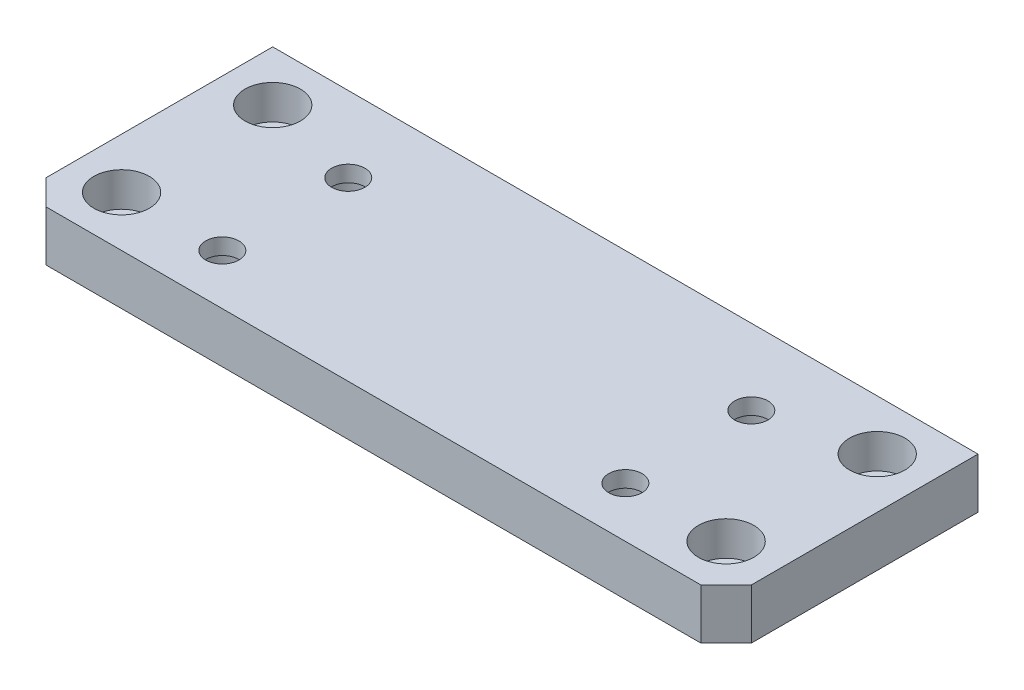
ISO-10303-21;
HEADER;
FILE_DESCRIPTION(('STEP AP214'),'2;1');
FILE_NAME('part.step','',(''),(''),'','','');
FILE_SCHEMA(('AUTOMOTIVE_DESIGN { 1 0 10303 214 1 1 1 1 }'));
ENDSEC;
DATA;
#1=APPLICATION_CONTEXT('core data for automotive mechanical design processes');
#2=APPLICATION_PROTOCOL_DEFINITION('international standard','automotive_design',2000,#1);
#3=PRODUCT_CONTEXT('',#1,'mechanical');
#4=PRODUCT('Part','Part','',(#3));
#5=PRODUCT_RELATED_PRODUCT_CATEGORY('part','',(#4));
#6=PRODUCT_DEFINITION_FORMATION('','',#4);
#7=PRODUCT_DEFINITION_CONTEXT('part definition',#1,'design');
#8=PRODUCT_DEFINITION('design','',#6,#7);
#9=PRODUCT_DEFINITION_SHAPE('','',#8);
#10=(LENGTH_UNIT() NAMED_UNIT(*) SI_UNIT(.MILLI.,.METRE.));
#11=(NAMED_UNIT(*) PLANE_ANGLE_UNIT() SI_UNIT($,.RADIAN.));
#12=(NAMED_UNIT(*) SI_UNIT($,.STERADIAN.) SOLID_ANGLE_UNIT());
#13=UNCERTAINTY_MEASURE_WITH_UNIT(LENGTH_MEASURE(1.E-05),#10,'distance_accuracy_value','');
#14=(GEOMETRIC_REPRESENTATION_CONTEXT(3) GLOBAL_UNCERTAINTY_ASSIGNED_CONTEXT((#13)) GLOBAL_UNIT_ASSIGNED_CONTEXT((#10,
#11,#12)) REPRESENTATION_CONTEXT('',''));
#15=CARTESIAN_POINT('',(0.,0.,0.));
#16=DIRECTION('',(0.,0.,1.));
#17=DIRECTION('',(1.,0.,0.));
#18=AXIS2_PLACEMENT_3D('',#15,#16,#17);
#19=CARTESIAN_POINT('',(-70.,10.,25.));
#20=DIRECTION('',(1.,0.,0.));
#21=DIRECTION('',(0.,0.,-1.));
#22=AXIS2_PLACEMENT_3D('',#19,#20,#21);
#23=PLANE('',#22);
#24=DIRECTION('',(0.,0.,1.));
#25=VECTOR('',#24,1.);
#26=CARTESIAN_POINT('',(-70.,0.,25.));
#27=LINE('',#26,#25);
#28=CARTESIAN_POINT('',(-70.,0.,-25.));
#29=VERTEX_POINT('',#28);
#30=CARTESIAN_POINT('',(-70.,0.,20.));
#31=VERTEX_POINT('',#30);
#32=EDGE_CURVE('E129',#29,#31,#27,.T.);
#33=ORIENTED_EDGE('',*,*,#32,.T.);
#34=DIRECTION('',(0.,1.,0.));
#35=VECTOR('',#34,1.);
#36=CARTESIAN_POINT('',(-70.,10.,20.));
#37=LINE('',#36,#35);
#38=CARTESIAN_POINT('',(-70.,10.,20.));
#39=VERTEX_POINT('',#38);
#40=EDGE_CURVE('E69',#31,#39,#37,.T.);
#41=ORIENTED_EDGE('',*,*,#40,.T.);
#42=DIRECTION('',(0.,0.,1.));
#43=VECTOR('',#42,1.);
#44=CARTESIAN_POINT('',(-70.,10.,25.));
#45=LINE('',#44,#43);
#46=CARTESIAN_POINT('',(-70.,10.,-25.));
#47=VERTEX_POINT('',#46);
#48=EDGE_CURVE('E141',#47,#39,#45,.T.);
#49=ORIENTED_EDGE('',*,*,#48,.F.);
#50=DIRECTION('',(0.,-1.,0.));
#51=VECTOR('',#50,1.);
#52=CARTESIAN_POINT('',(-70.,10.,-25.));
#53=LINE('',#52,#51);
#54=EDGE_CURVE('E119',#47,#29,#53,.T.);
#55=ORIENTED_EDGE('',*,*,#54,.T.);
#56=EDGE_LOOP('',(#33,#41,#49,#55));
#57=FACE_BOUND('',#56,.T.);
#58=ADVANCED_FACE('F44',(#57),#23,.F.);
#59=CARTESIAN_POINT('',(70.,10.,25.));
#60=DIRECTION('',(0.,0.,-1.));
#61=DIRECTION('',(-1.,0.,0.));
#62=AXIS2_PLACEMENT_3D('',#59,#60,#61);
#63=PLANE('',#62);
#64=DIRECTION('',(1.,0.,0.));
#65=VECTOR('',#64,1.);
#66=CARTESIAN_POINT('',(70.,10.,25.));
#67=LINE('',#66,#65);
#68=CARTESIAN_POINT('',(-65.,10.,25.));
#69=VERTEX_POINT('',#68);
#70=CARTESIAN_POINT('',(65.,10.,25.));
#71=VERTEX_POINT('',#70);
#72=EDGE_CURVE('E108',#69,#71,#67,.T.);
#73=ORIENTED_EDGE('',*,*,#72,.F.);
#74=DIRECTION('',(0.,-1.,0.));
#75=VECTOR('',#74,1.);
#76=CARTESIAN_POINT('',(-65.,10.,25.));
#77=LINE('',#76,#75);
#78=CARTESIAN_POINT('',(-65.,0.,25.));
#79=VERTEX_POINT('',#78);
#80=EDGE_CURVE('E145',#69,#79,#77,.T.);
#81=ORIENTED_EDGE('',*,*,#80,.T.);
#82=DIRECTION('',(1.,0.,0.));
#83=VECTOR('',#82,1.);
#84=CARTESIAN_POINT('',(70.,0.,25.));
#85=LINE('',#84,#83);
#86=CARTESIAN_POINT('',(65.,0.,25.));
#87=VERTEX_POINT('',#86);
#88=EDGE_CURVE('E132',#79,#87,#85,.T.);
#89=ORIENTED_EDGE('',*,*,#88,.T.);
#90=DIRECTION('',(0.,1.,0.));
#91=VECTOR('',#90,1.);
#92=CARTESIAN_POINT('',(65.,10.,25.));
#93=LINE('',#92,#91);
#94=EDGE_CURVE('E118',#87,#71,#93,.T.);
#95=ORIENTED_EDGE('',*,*,#94,.T.);
#96=EDGE_LOOP('',(#73,#81,#89,#95));
#97=FACE_BOUND('',#96,.T.);
#98=ADVANCED_FACE('F164',(#97),#63,.F.);
#99=CARTESIAN_POINT('',(70.,10.,25.));
#100=DIRECTION('',(-1.,0.,0.));
#101=DIRECTION('',(0.,0.,1.));
#102=AXIS2_PLACEMENT_3D('',#99,#100,#101);
#103=PLANE('',#102);
#104=DIRECTION('',(0.,0.,-1.));
#105=VECTOR('',#104,1.);
#106=CARTESIAN_POINT('',(70.,10.,25.));
#107=LINE('',#106,#105);
#108=CARTESIAN_POINT('',(70.,10.,20.));
#109=VERTEX_POINT('',#108);
#110=CARTESIAN_POINT('',(70.,10.,-25.));
#111=VERTEX_POINT('',#110);
#112=EDGE_CURVE('E99',#109,#111,#107,.T.);
#113=ORIENTED_EDGE('',*,*,#112,.F.);
#114=DIRECTION('',(0.,-1.,0.));
#115=VECTOR('',#114,1.);
#116=CARTESIAN_POINT('',(70.,10.,20.));
#117=LINE('',#116,#115);
#118=CARTESIAN_POINT('',(70.,0.,20.));
#119=VERTEX_POINT('',#118);
#120=EDGE_CURVE('E11',#109,#119,#117,.T.);
#121=ORIENTED_EDGE('',*,*,#120,.T.);
#122=DIRECTION('',(0.,0.,-1.));
#123=VECTOR('',#122,1.);
#124=CARTESIAN_POINT('',(70.,0.,25.));
#125=LINE('',#124,#123);
#126=CARTESIAN_POINT('',(70.,0.,-25.));
#127=VERTEX_POINT('',#126);
#128=EDGE_CURVE('E114',#119,#127,#125,.T.);
#129=ORIENTED_EDGE('',*,*,#128,.T.);
#130=DIRECTION('',(0.,-1.,0.));
#131=VECTOR('',#130,1.);
#132=CARTESIAN_POINT('',(70.,10.,-25.));
#133=LINE('',#132,#131);
#134=EDGE_CURVE('E111',#111,#127,#133,.T.);
#135=ORIENTED_EDGE('',*,*,#134,.F.);
#136=EDGE_LOOP('',(#113,#121,#129,#135));
#137=FACE_BOUND('',#136,.T.);
#138=ADVANCED_FACE('F112',(#137),#103,.F.);
#139=CARTESIAN_POINT('',(70.,10.,-25.));
#140=DIRECTION('',(0.,0.,1.));
#141=DIRECTION('',(1.,0.,0.));
#142=AXIS2_PLACEMENT_3D('',#139,#140,#141);
#143=PLANE('',#142);
#144=DIRECTION('',(-1.,0.,0.));
#145=VECTOR('',#144,1.);
#146=CARTESIAN_POINT('',(70.,0.,-25.));
#147=LINE('',#146,#145);
#148=EDGE_CURVE('E139',#127,#29,#147,.T.);
#149=ORIENTED_EDGE('',*,*,#148,.T.);
#150=ORIENTED_EDGE('',*,*,#54,.F.);
#151=DIRECTION('',(-1.,0.,0.));
#152=VECTOR('',#151,1.);
#153=CARTESIAN_POINT('',(70.,10.,-25.));
#154=LINE('',#153,#152);
#155=EDGE_CURVE('E103',#111,#47,#154,.T.);
#156=ORIENTED_EDGE('',*,*,#155,.F.);
#157=ORIENTED_EDGE('',*,*,#134,.T.);
#158=EDGE_LOOP('',(#149,#150,#156,#157));
#159=FACE_BOUND('',#158,.T.);
#160=ADVANCED_FACE('F121',(#159),#143,.F.);
#161=CARTESIAN_POINT('',(0.,10.,0.));
#162=DIRECTION('',(0.,1.,0.));
#163=DIRECTION('',(0.,0.,1.));
#164=AXIS2_PLACEMENT_3D('',#161,#162,#163);
#165=PLANE('',#164);
#166=CARTESIAN_POINT('',(40.,10.,-10.));
#167=DIRECTION('',(0.,-1.,0.));
#168=DIRECTION('',(0.,0.,-1.));
#169=AXIS2_PLACEMENT_3D('',#166,#167,#168);
#170=CIRCLE('',#169,3.3);
#171=CARTESIAN_POINT('',(40.,10.,-13.3));
#172=VERTEX_POINT('',#171);
#173=EDGE_CURVE('E286',#172,#172,#170,.T.);
#174=ORIENTED_EDGE('',*,*,#173,.T.);
#175=EDGE_LOOP('',(#174));
#176=FACE_BOUND('',#175,.T.);
#177=CARTESIAN_POINT('',(40.,10.,15.));
#178=DIRECTION('',(0.,-1.,0.));
#179=DIRECTION('',(0.,0.,-1.));
#180=AXIS2_PLACEMENT_3D('',#177,#178,#179);
#181=CIRCLE('',#180,3.3);
#182=CARTESIAN_POINT('',(40.,10.,11.7));
#183=VERTEX_POINT('',#182);
#184=EDGE_CURVE('E270',#183,#183,#181,.T.);
#185=ORIENTED_EDGE('',*,*,#184,.T.);
#186=EDGE_LOOP('',(#185));
#187=FACE_BOUND('',#186,.T.);
#188=CARTESIAN_POINT('',(-40.,10.,15.));
#189=DIRECTION('',(0.,-1.,0.));
#190=DIRECTION('',(0.,0.,-1.));
#191=AXIS2_PLACEMENT_3D('',#188,#189,#190);
#192=CIRCLE('',#191,3.3);
#193=CARTESIAN_POINT('',(-40.,10.,11.7));
#194=VERTEX_POINT('',#193);
#195=EDGE_CURVE('E254',#194,#194,#192,.T.);
#196=ORIENTED_EDGE('',*,*,#195,.T.);
#197=EDGE_LOOP('',(#196));
#198=FACE_BOUND('',#197,.T.);
#199=CARTESIAN_POINT('',(-40.,10.,-10.));
#200=DIRECTION('',(0.,-1.,0.));
#201=DIRECTION('',(0.,0.,-1.));
#202=AXIS2_PLACEMENT_3D('',#199,#200,#201);
#203=CIRCLE('',#202,3.3);
#204=CARTESIAN_POINT('',(-40.,10.,-13.3));
#205=VERTEX_POINT('',#204);
#206=EDGE_CURVE('E238',#205,#205,#203,.T.);
#207=ORIENTED_EDGE('',*,*,#206,.T.);
#208=EDGE_LOOP('',(#207));
#209=FACE_BOUND('',#208,.T.);
#210=CARTESIAN_POINT('',(-60.,10.,-15.));
#211=DIRECTION('',(0.,1.,0.));
#212=DIRECTION('',(0.,0.,1.));
#213=AXIS2_PLACEMENT_3D('',#210,#211,#212);
#214=CIRCLE('',#213,5.49999999999999);
#215=CARTESIAN_POINT('',(-60.,10.,-9.50000000000001));
#216=VERTEX_POINT('',#215);
#217=EDGE_CURVE('E234',#216,#216,#214,.T.);
#218=ORIENTED_EDGE('',*,*,#217,.F.);
#219=EDGE_LOOP('',(#218));
#220=FACE_BOUND('',#219,.T.);
#221=CARTESIAN_POINT('',(60.,10.,-15.));
#222=DIRECTION('',(0.,1.,0.));
#223=DIRECTION('',(0.,0.,1.));
#224=AXIS2_PLACEMENT_3D('',#221,#222,#223);
#225=CIRCLE('',#224,5.49999999999999);
#226=CARTESIAN_POINT('',(60.,10.,-9.50000000000003));
#227=VERTEX_POINT('',#226);
#228=EDGE_CURVE('E218',#227,#227,#225,.T.);
#229=ORIENTED_EDGE('',*,*,#228,.F.);
#230=EDGE_LOOP('',(#229));
#231=FACE_BOUND('',#230,.T.);
#232=CARTESIAN_POINT('',(60.,10.,15.));
#233=DIRECTION('',(0.,1.,0.));
#234=DIRECTION('',(0.,0.,1.));
#235=AXIS2_PLACEMENT_3D('',#232,#233,#234);
#236=CIRCLE('',#235,5.49999999999999);
#237=CARTESIAN_POINT('',(60.,10.,20.5));
#238=VERTEX_POINT('',#237);
#239=EDGE_CURVE('E202',#238,#238,#236,.T.);
#240=ORIENTED_EDGE('',*,*,#239,.F.);
#241=EDGE_LOOP('',(#240));
#242=FACE_BOUND('',#241,.T.);
#243=CARTESIAN_POINT('',(-60.,10.,15.));
#244=DIRECTION('',(0.,1.,0.));
#245=DIRECTION('',(0.,0.,1.));
#246=AXIS2_PLACEMENT_3D('',#243,#244,#245);
#247=CIRCLE('',#246,5.49999999999999);
#248=CARTESIAN_POINT('',(-60.,10.,20.5));
#249=VERTEX_POINT('',#248);
#250=EDGE_CURVE('E186',#249,#249,#247,.T.);
#251=ORIENTED_EDGE('',*,*,#250,.F.);
#252=EDGE_LOOP('',(#251));
#253=FACE_BOUND('',#252,.T.);
#254=ORIENTED_EDGE('',*,*,#48,.T.);
#255=DIRECTION('',(-0.707106781186548,0.,-0.707106781186548));
#256=VECTOR('',#255,1.);
#257=CARTESIAN_POINT('',(-45.,10.,45.));
#258=LINE('',#257,#256);
#259=EDGE_CURVE('E54',#39,#69,#258,.F.);
#260=ORIENTED_EDGE('',*,*,#259,.T.);
#261=ORIENTED_EDGE('',*,*,#72,.T.);
#262=DIRECTION('',(-0.707106781186549,0.,0.707106781186547));
#263=VECTOR('',#262,1.);
#264=CARTESIAN_POINT('',(44.9999999999999,10.,45.));
#265=LINE('',#264,#263);
#266=EDGE_CURVE('E61',#71,#109,#265,.F.);
#267=ORIENTED_EDGE('',*,*,#266,.T.);
#268=ORIENTED_EDGE('',*,*,#112,.T.);
#269=ORIENTED_EDGE('',*,*,#155,.T.);
#270=EDGE_LOOP('',(#254,#260,#261,#267,#268,#269));
#271=FACE_BOUND('',#270,.T.);
#272=ADVANCED_FACE('F101',(#176,#187,#198,#209,#220,#231,#242,#253,#271),#165,.T.);
#273=CARTESIAN_POINT('',(0.,0.,0.));
#274=DIRECTION('',(0.,1.,0.));
#275=DIRECTION('',(0.,0.,1.));
#276=AXIS2_PLACEMENT_3D('',#273,#274,#275);
#277=PLANE('',#276);
#278=CARTESIAN_POINT('',(40.,0.,-10.));
#279=DIRECTION('',(0.,-1.,0.));
#280=DIRECTION('',(0.,0.,-1.));
#281=AXIS2_PLACEMENT_3D('',#278,#279,#280);
#282=CIRCLE('',#281,5.5);
#283=CARTESIAN_POINT('',(40.,0.,-15.5));
#284=VERTEX_POINT('',#283);
#285=EDGE_CURVE('E298',#284,#284,#282,.T.);
#286=ORIENTED_EDGE('',*,*,#285,.F.);
#287=EDGE_LOOP('',(#286));
#288=FACE_BOUND('',#287,.T.);
#289=CARTESIAN_POINT('',(40.,0.,15.));
#290=DIRECTION('',(0.,-1.,0.));
#291=DIRECTION('',(0.,0.,-1.));
#292=AXIS2_PLACEMENT_3D('',#289,#290,#291);
#293=CIRCLE('',#292,5.49999999999999);
#294=CARTESIAN_POINT('',(40.,0.,9.50000000000002));
#295=VERTEX_POINT('',#294);
#296=EDGE_CURVE('E282',#295,#295,#293,.T.);
#297=ORIENTED_EDGE('',*,*,#296,.F.);
#298=EDGE_LOOP('',(#297));
#299=FACE_BOUND('',#298,.T.);
#300=CARTESIAN_POINT('',(-40.,0.,15.));
#301=DIRECTION('',(0.,-1.,0.));
#302=DIRECTION('',(0.,0.,-1.));
#303=AXIS2_PLACEMENT_3D('',#300,#301,#302);
#304=CIRCLE('',#303,5.49999999999999);
#305=CARTESIAN_POINT('',(-40.,0.,9.50000000000002));
#306=VERTEX_POINT('',#305);
#307=EDGE_CURVE('E266',#306,#306,#304,.T.);
#308=ORIENTED_EDGE('',*,*,#307,.F.);
#309=EDGE_LOOP('',(#308));
#310=FACE_BOUND('',#309,.T.);
#311=CARTESIAN_POINT('',(-40.,0.,-10.));
#312=DIRECTION('',(0.,-1.,0.));
#313=DIRECTION('',(0.,0.,-1.));
#314=AXIS2_PLACEMENT_3D('',#311,#312,#313);
#315=CIRCLE('',#314,5.5);
#316=CARTESIAN_POINT('',(-40.,0.,-15.5));
#317=VERTEX_POINT('',#316);
#318=EDGE_CURVE('E250',#317,#317,#315,.T.);
#319=ORIENTED_EDGE('',*,*,#318,.F.);
#320=EDGE_LOOP('',(#319));
#321=FACE_BOUND('',#320,.T.);
#322=CARTESIAN_POINT('',(-60.,0.,-15.));
#323=DIRECTION('',(0.,1.,0.));
#324=DIRECTION('',(0.,0.,1.));
#325=AXIS2_PLACEMENT_3D('',#322,#323,#324);
#326=CIRCLE('',#325,3.3);
#327=CARTESIAN_POINT('',(-60.,0.,-11.7));
#328=VERTEX_POINT('',#327);
#329=EDGE_CURVE('E222',#328,#328,#326,.T.);
#330=ORIENTED_EDGE('',*,*,#329,.T.);
#331=EDGE_LOOP('',(#330));
#332=FACE_BOUND('',#331,.T.);
#333=CARTESIAN_POINT('',(60.,0.,-15.));
#334=DIRECTION('',(0.,1.,0.));
#335=DIRECTION('',(0.,0.,1.));
#336=AXIS2_PLACEMENT_3D('',#333,#334,#335);
#337=CIRCLE('',#336,3.3);
#338=CARTESIAN_POINT('',(60.,0.,-11.7));
#339=VERTEX_POINT('',#338);
#340=EDGE_CURVE('E206',#339,#339,#337,.T.);
#341=ORIENTED_EDGE('',*,*,#340,.T.);
#342=EDGE_LOOP('',(#341));
#343=FACE_BOUND('',#342,.T.);
#344=CARTESIAN_POINT('',(60.,0.,15.));
#345=DIRECTION('',(0.,1.,0.));
#346=DIRECTION('',(0.,0.,1.));
#347=AXIS2_PLACEMENT_3D('',#344,#345,#346);
#348=CIRCLE('',#347,3.3);
#349=CARTESIAN_POINT('',(60.,0.,18.3));
#350=VERTEX_POINT('',#349);
#351=EDGE_CURVE('E190',#350,#350,#348,.T.);
#352=ORIENTED_EDGE('',*,*,#351,.T.);
#353=EDGE_LOOP('',(#352));
#354=FACE_BOUND('',#353,.T.);
#355=CARTESIAN_POINT('',(-60.,0.,15.));
#356=DIRECTION('',(0.,1.,0.));
#357=DIRECTION('',(0.,0.,1.));
#358=AXIS2_PLACEMENT_3D('',#355,#356,#357);
#359=CIRCLE('',#358,3.3);
#360=CARTESIAN_POINT('',(-60.,0.,18.3));
#361=VERTEX_POINT('',#360);
#362=EDGE_CURVE('E133',#361,#361,#359,.T.);
#363=ORIENTED_EDGE('',*,*,#362,.T.);
#364=EDGE_LOOP('',(#363));
#365=FACE_BOUND('',#364,.T.);
#366=ORIENTED_EDGE('',*,*,#88,.F.);
#367=DIRECTION('',(0.707106781186548,0.,0.707106781186548));
#368=VECTOR('',#367,1.);
#369=CARTESIAN_POINT('',(-65.,0.,25.));
#370=LINE('',#369,#368);
#371=EDGE_CURVE('E152',#79,#31,#370,.F.);
#372=ORIENTED_EDGE('',*,*,#371,.T.);
#373=ORIENTED_EDGE('',*,*,#32,.F.);
#374=ORIENTED_EDGE('',*,*,#148,.F.);
#375=ORIENTED_EDGE('',*,*,#128,.F.);
#376=DIRECTION('',(0.707106781186549,0.,-0.707106781186547));
#377=VECTOR('',#376,1.);
#378=CARTESIAN_POINT('',(70.,0.,20.));
#379=LINE('',#378,#377);
#380=EDGE_CURVE('E149',#119,#87,#379,.F.);
#381=ORIENTED_EDGE('',*,*,#380,.T.);
#382=EDGE_LOOP('',(#366,#372,#373,#374,#375,#381));
#383=FACE_BOUND('',#382,.T.);
#384=ADVANCED_FACE('F171',(#288,#299,#310,#321,#332,#343,#354,#365,#383),#277,.F.);
#385=CARTESIAN_POINT('',(-60.,10.,15.));
#386=DIRECTION('',(0.,1.,0.));
#387=DIRECTION('',(0.,0.,1.));
#388=AXIS2_PLACEMENT_3D('',#385,#386,#387);
#389=CYLINDRICAL_SURFACE('',#388,3.3);
#390=ORIENTED_EDGE('',*,*,#362,.F.);
#391=EDGE_LOOP('',(#390));
#392=FACE_BOUND('',#391,.T.);
#393=CARTESIAN_POINT('',(-60.,3.2,15.));
#394=DIRECTION('',(0.,1.,0.));
#395=DIRECTION('',(0.,0.,1.));
#396=AXIS2_PLACEMENT_3D('',#393,#394,#395);
#397=CIRCLE('',#396,3.30000000000001);
#398=CARTESIAN_POINT('',(-60.,3.2,18.3));
#399=VERTEX_POINT('',#398);
#400=EDGE_CURVE('E178',#399,#399,#397,.T.);
#401=ORIENTED_EDGE('',*,*,#400,.T.);
#402=EDGE_LOOP('',(#401));
#403=FACE_BOUND('',#402,.T.);
#404=ADVANCED_FACE('F307',(#392,#403),#389,.F.);
#405=CARTESIAN_POINT('',(-56.7,3.2,15.));
#406=DIRECTION('',(0.,-1.,0.));
#407=DIRECTION('',(0.,0.,-1.));
#408=AXIS2_PLACEMENT_3D('',#405,#406,#407);
#409=PLANE('',#408);
#410=ORIENTED_EDGE('',*,*,#400,.F.);
#411=EDGE_LOOP('',(#410));
#412=FACE_BOUND('',#411,.T.);
#413=CARTESIAN_POINT('',(-60.,3.2,15.));
#414=DIRECTION('',(0.,1.,0.));
#415=DIRECTION('',(0.,0.,1.));
#416=AXIS2_PLACEMENT_3D('',#413,#414,#415);
#417=CIRCLE('',#416,5.49999999999999);
#418=CARTESIAN_POINT('',(-60.,3.2,20.5));
#419=VERTEX_POINT('',#418);
#420=EDGE_CURVE('E182',#419,#419,#417,.T.);
#421=ORIENTED_EDGE('',*,*,#420,.T.);
#422=EDGE_LOOP('',(#421));
#423=FACE_BOUND('',#422,.T.);
#424=ADVANCED_FACE('F325',(#412,#423),#409,.F.);
#425=CARTESIAN_POINT('',(-60.,10.,15.));
#426=DIRECTION('',(0.,1.,0.));
#427=DIRECTION('',(0.,0.,1.));
#428=AXIS2_PLACEMENT_3D('',#425,#426,#427);
#429=CYLINDRICAL_SURFACE('',#428,5.49999999999999);
#430=ORIENTED_EDGE('',*,*,#420,.F.);
#431=EDGE_LOOP('',(#430));
#432=FACE_BOUND('',#431,.T.);
#433=ORIENTED_EDGE('',*,*,#250,.T.);
#434=EDGE_LOOP('',(#433));
#435=FACE_BOUND('',#434,.T.);
#436=ADVANCED_FACE('F331',(#432,#435),#429,.F.);
#437=CARTESIAN_POINT('',(60.,10.,15.));
#438=DIRECTION('',(0.,1.,0.));
#439=DIRECTION('',(0.,0.,1.));
#440=AXIS2_PLACEMENT_3D('',#437,#438,#439);
#441=CYLINDRICAL_SURFACE('',#440,3.3);
#442=ORIENTED_EDGE('',*,*,#351,.F.);
#443=EDGE_LOOP('',(#442));
#444=FACE_BOUND('',#443,.T.);
#445=CARTESIAN_POINT('',(60.,3.2,15.));
#446=DIRECTION('',(0.,1.,0.));
#447=DIRECTION('',(0.,0.,1.));
#448=AXIS2_PLACEMENT_3D('',#445,#446,#447);
#449=CIRCLE('',#448,3.30000000000001);
#450=CARTESIAN_POINT('',(60.,3.2,18.3));
#451=VERTEX_POINT('',#450);
#452=EDGE_CURVE('E194',#451,#451,#449,.T.);
#453=ORIENTED_EDGE('',*,*,#452,.T.);
#454=EDGE_LOOP('',(#453));
#455=FACE_BOUND('',#454,.T.);
#456=ADVANCED_FACE('F337',(#444,#455),#441,.F.);
#457=CARTESIAN_POINT('',(63.3,3.2,15.));
#458=DIRECTION('',(0.,-1.,0.));
#459=DIRECTION('',(0.,0.,-1.));
#460=AXIS2_PLACEMENT_3D('',#457,#458,#459);
#461=PLANE('',#460);
#462=ORIENTED_EDGE('',*,*,#452,.F.);
#463=EDGE_LOOP('',(#462));
#464=FACE_BOUND('',#463,.T.);
#465=CARTESIAN_POINT('',(60.,3.2,15.));
#466=DIRECTION('',(0.,1.,0.));
#467=DIRECTION('',(0.,0.,1.));
#468=AXIS2_PLACEMENT_3D('',#465,#466,#467);
#469=CIRCLE('',#468,5.49999999999999);
#470=CARTESIAN_POINT('',(60.,3.2,20.5));
#471=VERTEX_POINT('',#470);
#472=EDGE_CURVE('E198',#471,#471,#469,.T.);
#473=ORIENTED_EDGE('',*,*,#472,.T.);
#474=EDGE_LOOP('',(#473));
#475=FACE_BOUND('',#474,.T.);
#476=ADVANCED_FACE('F442',(#464,#475),#461,.F.);
#477=CARTESIAN_POINT('',(60.,10.,15.));
#478=DIRECTION('',(0.,1.,0.));
#479=DIRECTION('',(0.,0.,1.));
#480=AXIS2_PLACEMENT_3D('',#477,#478,#479);
#481=CYLINDRICAL_SURFACE('',#480,5.49999999999999);
#482=ORIENTED_EDGE('',*,*,#472,.F.);
#483=EDGE_LOOP('',(#482));
#484=FACE_BOUND('',#483,.T.);
#485=ORIENTED_EDGE('',*,*,#239,.T.);
#486=EDGE_LOOP('',(#485));
#487=FACE_BOUND('',#486,.T.);
#488=ADVANCED_FACE('F438',(#484,#487),#481,.F.);
#489=CARTESIAN_POINT('',(60.,10.,-15.));
#490=DIRECTION('',(0.,1.,0.));
#491=DIRECTION('',(0.,0.,1.));
#492=AXIS2_PLACEMENT_3D('',#489,#490,#491);
#493=CYLINDRICAL_SURFACE('',#492,3.3);
#494=ORIENTED_EDGE('',*,*,#340,.F.);
#495=EDGE_LOOP('',(#494));
#496=FACE_BOUND('',#495,.T.);
#497=CARTESIAN_POINT('',(60.,3.2,-15.));
#498=DIRECTION('',(0.,1.,0.));
#499=DIRECTION('',(0.,0.,1.));
#500=AXIS2_PLACEMENT_3D('',#497,#498,#499);
#501=CIRCLE('',#500,3.30000000000001);
#502=CARTESIAN_POINT('',(60.,3.2,-11.7));
#503=VERTEX_POINT('',#502);
#504=EDGE_CURVE('E210',#503,#503,#501,.T.);
#505=ORIENTED_EDGE('',*,*,#504,.T.);
#506=EDGE_LOOP('',(#505));
#507=FACE_BOUND('',#506,.T.);
#508=ADVANCED_FACE('F434',(#496,#507),#493,.F.);
#509=CARTESIAN_POINT('',(63.3,3.2,-15.));
#510=DIRECTION('',(0.,-1.,0.));
#511=DIRECTION('',(0.,0.,-1.));
#512=AXIS2_PLACEMENT_3D('',#509,#510,#511);
#513=PLANE('',#512);
#514=ORIENTED_EDGE('',*,*,#504,.F.);
#515=EDGE_LOOP('',(#514));
#516=FACE_BOUND('',#515,.T.);
#517=CARTESIAN_POINT('',(60.,3.2,-15.));
#518=DIRECTION('',(0.,1.,0.));
#519=DIRECTION('',(0.,0.,1.));
#520=AXIS2_PLACEMENT_3D('',#517,#518,#519);
#521=CIRCLE('',#520,5.49999999999999);
#522=CARTESIAN_POINT('',(60.,3.2,-9.50000000000003));
#523=VERTEX_POINT('',#522);
#524=EDGE_CURVE('E214',#523,#523,#521,.T.);
#525=ORIENTED_EDGE('',*,*,#524,.T.);
#526=EDGE_LOOP('',(#525));
#527=FACE_BOUND('',#526,.T.);
#528=ADVANCED_FACE('F430',(#516,#527),#513,.F.);
#529=CARTESIAN_POINT('',(60.,10.,-15.));
#530=DIRECTION('',(0.,1.,0.));
#531=DIRECTION('',(0.,0.,1.));
#532=AXIS2_PLACEMENT_3D('',#529,#530,#531);
#533=CYLINDRICAL_SURFACE('',#532,5.49999999999999);
#534=ORIENTED_EDGE('',*,*,#524,.F.);
#535=EDGE_LOOP('',(#534));
#536=FACE_BOUND('',#535,.T.);
#537=ORIENTED_EDGE('',*,*,#228,.T.);
#538=EDGE_LOOP('',(#537));
#539=FACE_BOUND('',#538,.T.);
#540=ADVANCED_FACE('F426',(#536,#539),#533,.F.);
#541=CARTESIAN_POINT('',(-60.,10.,-15.));
#542=DIRECTION('',(0.,1.,0.));
#543=DIRECTION('',(0.,0.,1.));
#544=AXIS2_PLACEMENT_3D('',#541,#542,#543);
#545=CYLINDRICAL_SURFACE('',#544,3.3);
#546=ORIENTED_EDGE('',*,*,#329,.F.);
#547=EDGE_LOOP('',(#546));
#548=FACE_BOUND('',#547,.T.);
#549=CARTESIAN_POINT('',(-60.,3.2,-15.));
#550=DIRECTION('',(0.,1.,0.));
#551=DIRECTION('',(0.,0.,1.));
#552=AXIS2_PLACEMENT_3D('',#549,#550,#551);
#553=CIRCLE('',#552,3.30000000000001);
#554=CARTESIAN_POINT('',(-60.,3.2,-11.7));
#555=VERTEX_POINT('',#554);
#556=EDGE_CURVE('E226',#555,#555,#553,.T.);
#557=ORIENTED_EDGE('',*,*,#556,.T.);
#558=EDGE_LOOP('',(#557));
#559=FACE_BOUND('',#558,.T.);
#560=ADVANCED_FACE('F422',(#548,#559),#545,.F.);
#561=CARTESIAN_POINT('',(-56.7,3.2,-15.));
#562=DIRECTION('',(0.,-1.,0.));
#563=DIRECTION('',(0.,0.,-1.));
#564=AXIS2_PLACEMENT_3D('',#561,#562,#563);
#565=PLANE('',#564);
#566=ORIENTED_EDGE('',*,*,#556,.F.);
#567=EDGE_LOOP('',(#566));
#568=FACE_BOUND('',#567,.T.);
#569=CARTESIAN_POINT('',(-60.,3.2,-15.));
#570=DIRECTION('',(0.,1.,0.));
#571=DIRECTION('',(0.,0.,1.));
#572=AXIS2_PLACEMENT_3D('',#569,#570,#571);
#573=CIRCLE('',#572,5.49999999999999);
#574=CARTESIAN_POINT('',(-60.,3.2,-9.50000000000001));
#575=VERTEX_POINT('',#574);
#576=EDGE_CURVE('E230',#575,#575,#573,.T.);
#577=ORIENTED_EDGE('',*,*,#576,.T.);
#578=EDGE_LOOP('',(#577));
#579=FACE_BOUND('',#578,.T.);
#580=ADVANCED_FACE('F418',(#568,#579),#565,.F.);
#581=CARTESIAN_POINT('',(-60.,10.,-15.));
#582=DIRECTION('',(0.,1.,0.));
#583=DIRECTION('',(0.,0.,1.));
#584=AXIS2_PLACEMENT_3D('',#581,#582,#583);
#585=CYLINDRICAL_SURFACE('',#584,5.49999999999999);
#586=ORIENTED_EDGE('',*,*,#576,.F.);
#587=EDGE_LOOP('',(#586));
#588=FACE_BOUND('',#587,.T.);
#589=ORIENTED_EDGE('',*,*,#217,.T.);
#590=EDGE_LOOP('',(#589));
#591=FACE_BOUND('',#590,.T.);
#592=ADVANCED_FACE('F414',(#588,#591),#585,.F.);
#593=CARTESIAN_POINT('',(-40.,0.,-10.));
#594=DIRECTION('',(0.,-1.,0.));
#595=DIRECTION('',(0.,0.,-1.));
#596=AXIS2_PLACEMENT_3D('',#593,#594,#595);
#597=CYLINDRICAL_SURFACE('',#596,3.3);
#598=ORIENTED_EDGE('',*,*,#206,.F.);
#599=EDGE_LOOP('',(#598));
#600=FACE_BOUND('',#599,.T.);
#601=CARTESIAN_POINT('',(-40.,6.8,-10.));
#602=DIRECTION('',(0.,-1.,0.));
#603=DIRECTION('',(0.,0.,-1.));
#604=AXIS2_PLACEMENT_3D('',#601,#602,#603);
#605=CIRCLE('',#604,3.30000000000001);
#606=CARTESIAN_POINT('',(-40.,6.8,-13.3));
#607=VERTEX_POINT('',#606);
#608=EDGE_CURVE('E242',#607,#607,#605,.T.);
#609=ORIENTED_EDGE('',*,*,#608,.T.);
#610=EDGE_LOOP('',(#609));
#611=FACE_BOUND('',#610,.T.);
#612=ADVANCED_FACE('F410',(#600,#611),#597,.F.);
#613=CARTESIAN_POINT('',(-36.7,6.8,-10.));
#614=DIRECTION('',(0.,1.,0.));
#615=DIRECTION('',(0.,0.,1.));
#616=AXIS2_PLACEMENT_3D('',#613,#614,#615);
#617=PLANE('',#616);
#618=ORIENTED_EDGE('',*,*,#608,.F.);
#619=EDGE_LOOP('',(#618));
#620=FACE_BOUND('',#619,.T.);
#621=CARTESIAN_POINT('',(-40.,6.8,-10.));
#622=DIRECTION('',(0.,-1.,0.));
#623=DIRECTION('',(0.,0.,-1.));
#624=AXIS2_PLACEMENT_3D('',#621,#622,#623);
#625=CIRCLE('',#624,5.5);
#626=CARTESIAN_POINT('',(-40.,6.8,-15.5));
#627=VERTEX_POINT('',#626);
#628=EDGE_CURVE('E246',#627,#627,#625,.T.);
#629=ORIENTED_EDGE('',*,*,#628,.T.);
#630=EDGE_LOOP('',(#629));
#631=FACE_BOUND('',#630,.T.);
#632=ADVANCED_FACE('F406',(#620,#631),#617,.F.);
#633=CARTESIAN_POINT('',(-40.,0.,-10.));
#634=DIRECTION('',(0.,-1.,0.));
#635=DIRECTION('',(0.,0.,-1.));
#636=AXIS2_PLACEMENT_3D('',#633,#634,#635);
#637=CYLINDRICAL_SURFACE('',#636,5.5);
#638=ORIENTED_EDGE('',*,*,#628,.F.);
#639=EDGE_LOOP('',(#638));
#640=FACE_BOUND('',#639,.T.);
#641=ORIENTED_EDGE('',*,*,#318,.T.);
#642=EDGE_LOOP('',(#641));
#643=FACE_BOUND('',#642,.T.);
#644=ADVANCED_FACE('F402',(#640,#643),#637,.F.);
#645=CARTESIAN_POINT('',(-40.,0.,15.));
#646=DIRECTION('',(0.,-1.,0.));
#647=DIRECTION('',(0.,0.,-1.));
#648=AXIS2_PLACEMENT_3D('',#645,#646,#647);
#649=CYLINDRICAL_SURFACE('',#648,3.3);
#650=ORIENTED_EDGE('',*,*,#195,.F.);
#651=EDGE_LOOP('',(#650));
#652=FACE_BOUND('',#651,.T.);
#653=CARTESIAN_POINT('',(-40.,6.8,15.));
#654=DIRECTION('',(0.,-1.,0.));
#655=DIRECTION('',(0.,0.,-1.));
#656=AXIS2_PLACEMENT_3D('',#653,#654,#655);
#657=CIRCLE('',#656,3.30000000000001);
#658=CARTESIAN_POINT('',(-40.,6.8,11.7));
#659=VERTEX_POINT('',#658);
#660=EDGE_CURVE('E258',#659,#659,#657,.T.);
#661=ORIENTED_EDGE('',*,*,#660,.T.);
#662=EDGE_LOOP('',(#661));
#663=FACE_BOUND('',#662,.T.);
#664=ADVANCED_FACE('F398',(#652,#663),#649,.F.);
#665=CARTESIAN_POINT('',(-36.7,6.8,15.));
#666=DIRECTION('',(0.,1.,0.));
#667=DIRECTION('',(0.,0.,1.));
#668=AXIS2_PLACEMENT_3D('',#665,#666,#667);
#669=PLANE('',#668);
#670=ORIENTED_EDGE('',*,*,#660,.F.);
#671=EDGE_LOOP('',(#670));
#672=FACE_BOUND('',#671,.T.);
#673=CARTESIAN_POINT('',(-40.,6.8,15.));
#674=DIRECTION('',(0.,-1.,0.));
#675=DIRECTION('',(0.,0.,-1.));
#676=AXIS2_PLACEMENT_3D('',#673,#674,#675);
#677=CIRCLE('',#676,5.49999999999999);
#678=CARTESIAN_POINT('',(-40.,6.8,9.50000000000002));
#679=VERTEX_POINT('',#678);
#680=EDGE_CURVE('E262',#679,#679,#677,.T.);
#681=ORIENTED_EDGE('',*,*,#680,.T.);
#682=EDGE_LOOP('',(#681));
#683=FACE_BOUND('',#682,.T.);
#684=ADVANCED_FACE('F394',(#672,#683),#669,.F.);
#685=CARTESIAN_POINT('',(-40.,0.,15.));
#686=DIRECTION('',(0.,-1.,0.));
#687=DIRECTION('',(0.,0.,-1.));
#688=AXIS2_PLACEMENT_3D('',#685,#686,#687);
#689=CYLINDRICAL_SURFACE('',#688,5.49999999999999);
#690=ORIENTED_EDGE('',*,*,#680,.F.);
#691=EDGE_LOOP('',(#690));
#692=FACE_BOUND('',#691,.T.);
#693=ORIENTED_EDGE('',*,*,#307,.T.);
#694=EDGE_LOOP('',(#693));
#695=FACE_BOUND('',#694,.T.);
#696=ADVANCED_FACE('F390',(#692,#695),#689,.F.);
#697=CARTESIAN_POINT('',(40.,0.,15.));
#698=DIRECTION('',(0.,-1.,0.));
#699=DIRECTION('',(0.,0.,-1.));
#700=AXIS2_PLACEMENT_3D('',#697,#698,#699);
#701=CYLINDRICAL_SURFACE('',#700,3.3);
#702=ORIENTED_EDGE('',*,*,#184,.F.);
#703=EDGE_LOOP('',(#702));
#704=FACE_BOUND('',#703,.T.);
#705=CARTESIAN_POINT('',(40.,6.8,15.));
#706=DIRECTION('',(0.,-1.,0.));
#707=DIRECTION('',(0.,0.,-1.));
#708=AXIS2_PLACEMENT_3D('',#705,#706,#707);
#709=CIRCLE('',#708,3.30000000000001);
#710=CARTESIAN_POINT('',(40.,6.8,11.7));
#711=VERTEX_POINT('',#710);
#712=EDGE_CURVE('E274',#711,#711,#709,.T.);
#713=ORIENTED_EDGE('',*,*,#712,.T.);
#714=EDGE_LOOP('',(#713));
#715=FACE_BOUND('',#714,.T.);
#716=ADVANCED_FACE('F386',(#704,#715),#701,.F.);
#717=CARTESIAN_POINT('',(43.3,6.8,15.));
#718=DIRECTION('',(0.,1.,0.));
#719=DIRECTION('',(0.,0.,1.));
#720=AXIS2_PLACEMENT_3D('',#717,#718,#719);
#721=PLANE('',#720);
#722=ORIENTED_EDGE('',*,*,#712,.F.);
#723=EDGE_LOOP('',(#722));
#724=FACE_BOUND('',#723,.T.);
#725=CARTESIAN_POINT('',(40.,6.8,15.));
#726=DIRECTION('',(0.,-1.,0.));
#727=DIRECTION('',(0.,0.,-1.));
#728=AXIS2_PLACEMENT_3D('',#725,#726,#727);
#729=CIRCLE('',#728,5.49999999999999);
#730=CARTESIAN_POINT('',(40.,6.8,9.50000000000002));
#731=VERTEX_POINT('',#730);
#732=EDGE_CURVE('E278',#731,#731,#729,.T.);
#733=ORIENTED_EDGE('',*,*,#732,.T.);
#734=EDGE_LOOP('',(#733));
#735=FACE_BOUND('',#734,.T.);
#736=ADVANCED_FACE('F382',(#724,#735),#721,.F.);
#737=CARTESIAN_POINT('',(40.,0.,15.));
#738=DIRECTION('',(0.,-1.,0.));
#739=DIRECTION('',(0.,0.,-1.));
#740=AXIS2_PLACEMENT_3D('',#737,#738,#739);
#741=CYLINDRICAL_SURFACE('',#740,5.49999999999999);
#742=ORIENTED_EDGE('',*,*,#732,.F.);
#743=EDGE_LOOP('',(#742));
#744=FACE_BOUND('',#743,.T.);
#745=ORIENTED_EDGE('',*,*,#296,.T.);
#746=EDGE_LOOP('',(#745));
#747=FACE_BOUND('',#746,.T.);
#748=ADVANCED_FACE('F378',(#744,#747),#741,.F.);
#749=CARTESIAN_POINT('',(40.,0.,-10.));
#750=DIRECTION('',(0.,-1.,0.));
#751=DIRECTION('',(0.,0.,-1.));
#752=AXIS2_PLACEMENT_3D('',#749,#750,#751);
#753=CYLINDRICAL_SURFACE('',#752,3.3);
#754=ORIENTED_EDGE('',*,*,#173,.F.);
#755=EDGE_LOOP('',(#754));
#756=FACE_BOUND('',#755,.T.);
#757=CARTESIAN_POINT('',(40.,6.8,-10.));
#758=DIRECTION('',(0.,-1.,0.));
#759=DIRECTION('',(0.,0.,-1.));
#760=AXIS2_PLACEMENT_3D('',#757,#758,#759);
#761=CIRCLE('',#760,3.30000000000001);
#762=CARTESIAN_POINT('',(40.,6.8,-13.3));
#763=VERTEX_POINT('',#762);
#764=EDGE_CURVE('E290',#763,#763,#761,.T.);
#765=ORIENTED_EDGE('',*,*,#764,.T.);
#766=EDGE_LOOP('',(#765));
#767=FACE_BOUND('',#766,.T.);
#768=ADVANCED_FACE('F371',(#756,#767),#753,.F.);
#769=CARTESIAN_POINT('',(43.3,6.8,-10.));
#770=DIRECTION('',(0.,1.,0.));
#771=DIRECTION('',(0.,0.,1.));
#772=AXIS2_PLACEMENT_3D('',#769,#770,#771);
#773=PLANE('',#772);
#774=ORIENTED_EDGE('',*,*,#764,.F.);
#775=EDGE_LOOP('',(#774));
#776=FACE_BOUND('',#775,.T.);
#777=CARTESIAN_POINT('',(40.,6.8,-10.));
#778=DIRECTION('',(0.,-1.,0.));
#779=DIRECTION('',(0.,0.,-1.));
#780=AXIS2_PLACEMENT_3D('',#777,#778,#779);
#781=CIRCLE('',#780,5.5);
#782=CARTESIAN_POINT('',(40.,6.8,-15.5));
#783=VERTEX_POINT('',#782);
#784=EDGE_CURVE('E294',#783,#783,#781,.T.);
#785=ORIENTED_EDGE('',*,*,#784,.T.);
#786=EDGE_LOOP('',(#785));
#787=FACE_BOUND('',#786,.T.);
#788=ADVANCED_FACE('F365',(#776,#787),#773,.F.);
#789=CARTESIAN_POINT('',(40.,0.,-10.));
#790=DIRECTION('',(0.,-1.,0.));
#791=DIRECTION('',(0.,0.,-1.));
#792=AXIS2_PLACEMENT_3D('',#789,#790,#791);
#793=CYLINDRICAL_SURFACE('',#792,5.5);
#794=ORIENTED_EDGE('',*,*,#784,.F.);
#795=EDGE_LOOP('',(#794));
#796=FACE_BOUND('',#795,.T.);
#797=ORIENTED_EDGE('',*,*,#285,.T.);
#798=EDGE_LOOP('',(#797));
#799=FACE_BOUND('',#798,.T.);
#800=ADVANCED_FACE('F303',(#796,#799),#793,.F.);
#801=CARTESIAN_POINT('',(-65.,10.,25.));
#802=DIRECTION('',(0.707106781186548,0.,-0.707106781186548));
#803=DIRECTION('',(0.,-1.,0.));
#804=AXIS2_PLACEMENT_3D('',#801,#802,#803);
#805=PLANE('',#804);
#806=ORIENTED_EDGE('',*,*,#259,.F.);
#807=ORIENTED_EDGE('',*,*,#40,.F.);
#808=ORIENTED_EDGE('',*,*,#371,.F.);
#809=ORIENTED_EDGE('',*,*,#80,.F.);
#810=EDGE_LOOP('',(#806,#807,#808,#809));
#811=FACE_BOUND('',#810,.T.);
#812=ADVANCED_FACE('F168',(#811),#805,.F.);
#813=CARTESIAN_POINT('',(70.,10.,20.));
#814=DIRECTION('',(-0.707106781186546,0.,-0.707106781186548));
#815=DIRECTION('',(0.,-1.,0.));
#816=AXIS2_PLACEMENT_3D('',#813,#814,#815);
#817=PLANE('',#816);
#818=ORIENTED_EDGE('',*,*,#266,.F.);
#819=ORIENTED_EDGE('',*,*,#94,.F.);
#820=ORIENTED_EDGE('',*,*,#380,.F.);
#821=ORIENTED_EDGE('',*,*,#120,.F.);
#822=EDGE_LOOP('',(#818,#819,#820,#821));
#823=FACE_BOUND('',#822,.T.);
#824=ADVANCED_FACE('F47',(#823),#817,.F.);
#825=CLOSED_SHELL('',(#58,#98,#138,#160,#272,#384,#404,#424,#436,#456,#476,#488,#508,#528,#540,
#560,#580,#592,#612,#632,#644,#664,#684,#696,#716,#736,#748,#768,#788,#800,#812,#824));
#826=MANIFOLD_SOLID_BREP('B2',#825);
#827=ADVANCED_BREP_SHAPE_REPRESENTATION('',(#18,#826),#14);
#828=SHAPE_DEFINITION_REPRESENTATION(#9,#827);
ENDSEC;
END-ISO-10303-21;
